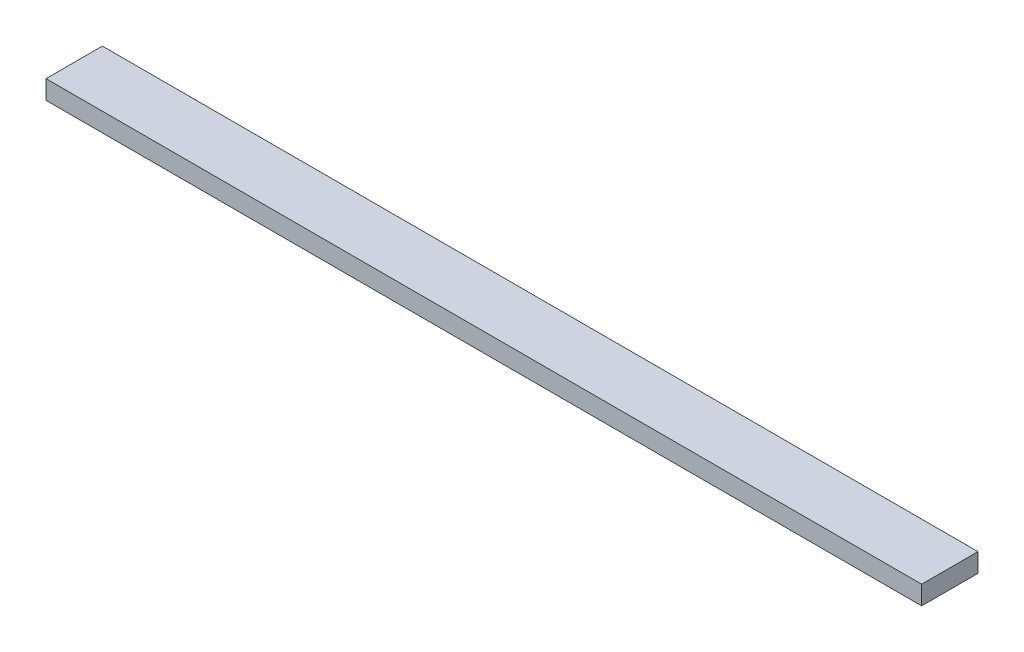
ISO-10303-21;
HEADER;
FILE_DESCRIPTION(('STEP AP214'),'2;1');
FILE_NAME('part.step','',(''),(''),'','','');
FILE_SCHEMA(('AUTOMOTIVE_DESIGN { 1 0 10303 214 1 1 1 1 }'));
ENDSEC;
DATA;
#1=APPLICATION_CONTEXT('core data for automotive mechanical design processes');
#2=APPLICATION_PROTOCOL_DEFINITION('international standard','automotive_design',2000,#1);
#3=PRODUCT_CONTEXT('',#1,'mechanical');
#4=PRODUCT('Part','Part','',(#3));
#5=PRODUCT_RELATED_PRODUCT_CATEGORY('part','',(#4));
#6=PRODUCT_DEFINITION_FORMATION('','',#4);
#7=PRODUCT_DEFINITION_CONTEXT('part definition',#1,'design');
#8=PRODUCT_DEFINITION('design','',#6,#7);
#9=PRODUCT_DEFINITION_SHAPE('','',#8);
#10=(LENGTH_UNIT() NAMED_UNIT(*) SI_UNIT(.MILLI.,.METRE.));
#11=(NAMED_UNIT(*) PLANE_ANGLE_UNIT() SI_UNIT($,.RADIAN.));
#12=(NAMED_UNIT(*) SI_UNIT($,.STERADIAN.) SOLID_ANGLE_UNIT());
#13=UNCERTAINTY_MEASURE_WITH_UNIT(LENGTH_MEASURE(1.E-05),#10,'distance_accuracy_value','');
#14=(GEOMETRIC_REPRESENTATION_CONTEXT(3) GLOBAL_UNCERTAINTY_ASSIGNED_CONTEXT((#13)) GLOBAL_UNIT_ASSIGNED_CONTEXT((#10,
#11,#12)) REPRESENTATION_CONTEXT('',''));
#15=CARTESIAN_POINT('',(0.,0.,0.));
#16=DIRECTION('',(0.,0.,1.));
#17=DIRECTION('',(1.,0.,0.));
#18=AXIS2_PLACEMENT_3D('',#15,#16,#17);
#19=CARTESIAN_POINT('',(0.,50.,0.));
#20=DIRECTION('',(1.,0.,0.));
#21=DIRECTION('',(0.,0.,-1.));
#22=AXIS2_PLACEMENT_3D('',#19,#20,#21);
#23=PLANE('',#22);
#24=DIRECTION('',(0.,0.,1.));
#25=VECTOR('',#24,1.);
#26=CARTESIAN_POINT('',(0.,0.,0.));
#27=LINE('',#26,#25);
#28=CARTESIAN_POINT('',(0.,0.,-150.));
#29=VERTEX_POINT('',#28);
#30=CARTESIAN_POINT('',(0.,0.,0.));
#31=VERTEX_POINT('',#30);
#32=EDGE_CURVE('E114',#29,#31,#27,.T.);
#33=ORIENTED_EDGE('',*,*,#32,.T.);
#34=DIRECTION('',(0.,-1.,0.));
#35=VECTOR('',#34,1.);
#36=CARTESIAN_POINT('',(0.,50.,0.));
#37=LINE('',#36,#35);
#38=CARTESIAN_POINT('',(0.,50.,0.));
#39=VERTEX_POINT('',#38);
#40=EDGE_CURVE('E11',#39,#31,#37,.T.);
#41=ORIENTED_EDGE('',*,*,#40,.F.);
#42=DIRECTION('',(0.,0.,1.));
#43=VECTOR('',#42,1.);
#44=CARTESIAN_POINT('',(0.,50.,0.));
#45=LINE('',#44,#43);
#46=CARTESIAN_POINT('',(0.,50.,-150.));
#47=VERTEX_POINT('',#46);
#48=EDGE_CURVE('E100',#47,#39,#45,.T.);
#49=ORIENTED_EDGE('',*,*,#48,.F.);
#50=DIRECTION('',(0.,-1.,0.));
#51=VECTOR('',#50,1.);
#52=CARTESIAN_POINT('',(0.,50.,-150.));
#53=LINE('',#52,#51);
#54=EDGE_CURVE('E108',#47,#29,#53,.T.);
#55=ORIENTED_EDGE('',*,*,#54,.T.);
#56=EDGE_LOOP('',(#33,#41,#49,#55));
#57=FACE_BOUND('',#56,.T.);
#58=ADVANCED_FACE('F44',(#57),#23,.F.);
#59=CARTESIAN_POINT('',(0.,50.,0.));
#60=DIRECTION('',(0.,0.,-1.));
#61=DIRECTION('',(-1.,0.,0.));
#62=AXIS2_PLACEMENT_3D('',#59,#60,#61);
#63=PLANE('',#62);
#64=DIRECTION('',(1.,0.,0.));
#65=VECTOR('',#64,1.);
#66=CARTESIAN_POINT('',(0.,0.,0.));
#67=LINE('',#66,#65);
#68=CARTESIAN_POINT('',(2330.,0.,0.));
#69=VERTEX_POINT('',#68);
#70=EDGE_CURVE('E105',#31,#69,#67,.T.);
#71=ORIENTED_EDGE('',*,*,#70,.T.);
#72=DIRECTION('',(0.,-1.,0.));
#73=VECTOR('',#72,1.);
#74=CARTESIAN_POINT('',(2330.,50.,0.));
#75=LINE('',#74,#73);
#76=CARTESIAN_POINT('',(2330.,50.,0.));
#77=VERTEX_POINT('',#76);
#78=EDGE_CURVE('E53',#77,#69,#75,.T.);
#79=ORIENTED_EDGE('',*,*,#78,.F.);
#80=DIRECTION('',(1.,0.,0.));
#81=VECTOR('',#80,1.);
#82=CARTESIAN_POINT('',(0.,50.,0.));
#83=LINE('',#82,#81);
#84=EDGE_CURVE('E95',#39,#77,#83,.T.);
#85=ORIENTED_EDGE('',*,*,#84,.F.);
#86=ORIENTED_EDGE('',*,*,#40,.T.);
#87=EDGE_LOOP('',(#71,#79,#85,#86));
#88=FACE_BOUND('',#87,.T.);
#89=ADVANCED_FACE('F101',(#88),#63,.F.);
#90=CARTESIAN_POINT('',(2330.,50.,0.));
#91=DIRECTION('',(-1.,0.,0.));
#92=DIRECTION('',(0.,0.,1.));
#93=AXIS2_PLACEMENT_3D('',#90,#91,#92);
#94=PLANE('',#93);
#95=DIRECTION('',(0.,0.,-1.));
#96=VECTOR('',#95,1.);
#97=CARTESIAN_POINT('',(2330.,0.,0.));
#98=LINE('',#97,#96);
#99=CARTESIAN_POINT('',(2330.,0.,-150.));
#100=VERTEX_POINT('',#99);
#101=EDGE_CURVE('E76',#69,#100,#98,.T.);
#102=ORIENTED_EDGE('',*,*,#101,.T.);
#103=DIRECTION('',(0.,-1.,0.));
#104=VECTOR('',#103,1.);
#105=CARTESIAN_POINT('',(2330.,50.,-150.));
#106=LINE('',#105,#104);
#107=CARTESIAN_POINT('',(2330.,50.,-150.));
#108=VERTEX_POINT('',#107);
#109=EDGE_CURVE('E102',#108,#100,#106,.T.);
#110=ORIENTED_EDGE('',*,*,#109,.F.);
#111=DIRECTION('',(0.,0.,-1.));
#112=VECTOR('',#111,1.);
#113=CARTESIAN_POINT('',(2330.,50.,0.));
#114=LINE('',#113,#112);
#115=EDGE_CURVE('E92',#77,#108,#114,.T.);
#116=ORIENTED_EDGE('',*,*,#115,.F.);
#117=ORIENTED_EDGE('',*,*,#78,.T.);
#118=EDGE_LOOP('',(#102,#110,#116,#117));
#119=FACE_BOUND('',#118,.T.);
#120=ADVANCED_FACE('F104',(#119),#94,.F.);
#121=CARTESIAN_POINT('',(0.,50.,-150.));
#122=DIRECTION('',(0.,0.,1.));
#123=DIRECTION('',(1.,0.,0.));
#124=AXIS2_PLACEMENT_3D('',#121,#122,#123);
#125=PLANE('',#124);
#126=DIRECTION('',(-1.,0.,0.));
#127=VECTOR('',#126,1.);
#128=CARTESIAN_POINT('',(0.,0.,-150.));
#129=LINE('',#128,#127);
#130=EDGE_CURVE('E81',#100,#29,#129,.T.);
#131=ORIENTED_EDGE('',*,*,#130,.T.);
#132=ORIENTED_EDGE('',*,*,#54,.F.);
#133=DIRECTION('',(-1.,0.,0.));
#134=VECTOR('',#133,1.);
#135=CARTESIAN_POINT('',(0.,50.,-150.));
#136=LINE('',#135,#134);
#137=EDGE_CURVE('E65',#108,#47,#136,.T.);
#138=ORIENTED_EDGE('',*,*,#137,.F.);
#139=ORIENTED_EDGE('',*,*,#109,.T.);
#140=EDGE_LOOP('',(#131,#132,#138,#139));
#141=FACE_BOUND('',#140,.T.);
#142=ADVANCED_FACE('F127',(#141),#125,.F.);
#143=CARTESIAN_POINT('',(0.,50.,0.));
#144=DIRECTION('',(0.,-1.,0.));
#145=DIRECTION('',(0.,0.,-1.));
#146=AXIS2_PLACEMENT_3D('',#143,#144,#145);
#147=PLANE('',#146);
#148=ORIENTED_EDGE('',*,*,#48,.T.);
#149=ORIENTED_EDGE('',*,*,#84,.T.);
#150=ORIENTED_EDGE('',*,*,#115,.T.);
#151=ORIENTED_EDGE('',*,*,#137,.T.);
#152=EDGE_LOOP('',(#148,#149,#150,#151));
#153=FACE_BOUND('',#152,.T.);
#154=ADVANCED_FACE('F91',(#153),#147,.F.);
#155=CARTESIAN_POINT('',(0.,0.,0.));
#156=DIRECTION('',(0.,-1.,0.));
#157=DIRECTION('',(0.,0.,-1.));
#158=AXIS2_PLACEMENT_3D('',#155,#156,#157);
#159=PLANE('',#158);
#160=ORIENTED_EDGE('',*,*,#32,.F.);
#161=ORIENTED_EDGE('',*,*,#130,.F.);
#162=ORIENTED_EDGE('',*,*,#101,.F.);
#163=ORIENTED_EDGE('',*,*,#70,.F.);
#164=EDGE_LOOP('',(#160,#161,#162,#163));
#165=FACE_BOUND('',#164,.T.);
#166=ADVANCED_FACE('F129',(#165),#159,.T.);
#167=CLOSED_SHELL('',(#58,#89,#120,#142,#154,#166));
#168=MANIFOLD_SOLID_BREP('B2',#167);
#169=ADVANCED_BREP_SHAPE_REPRESENTATION('',(#18,#168),#14);
#170=SHAPE_DEFINITION_REPRESENTATION(#9,#169);
ENDSEC;
END-ISO-10303-21;
